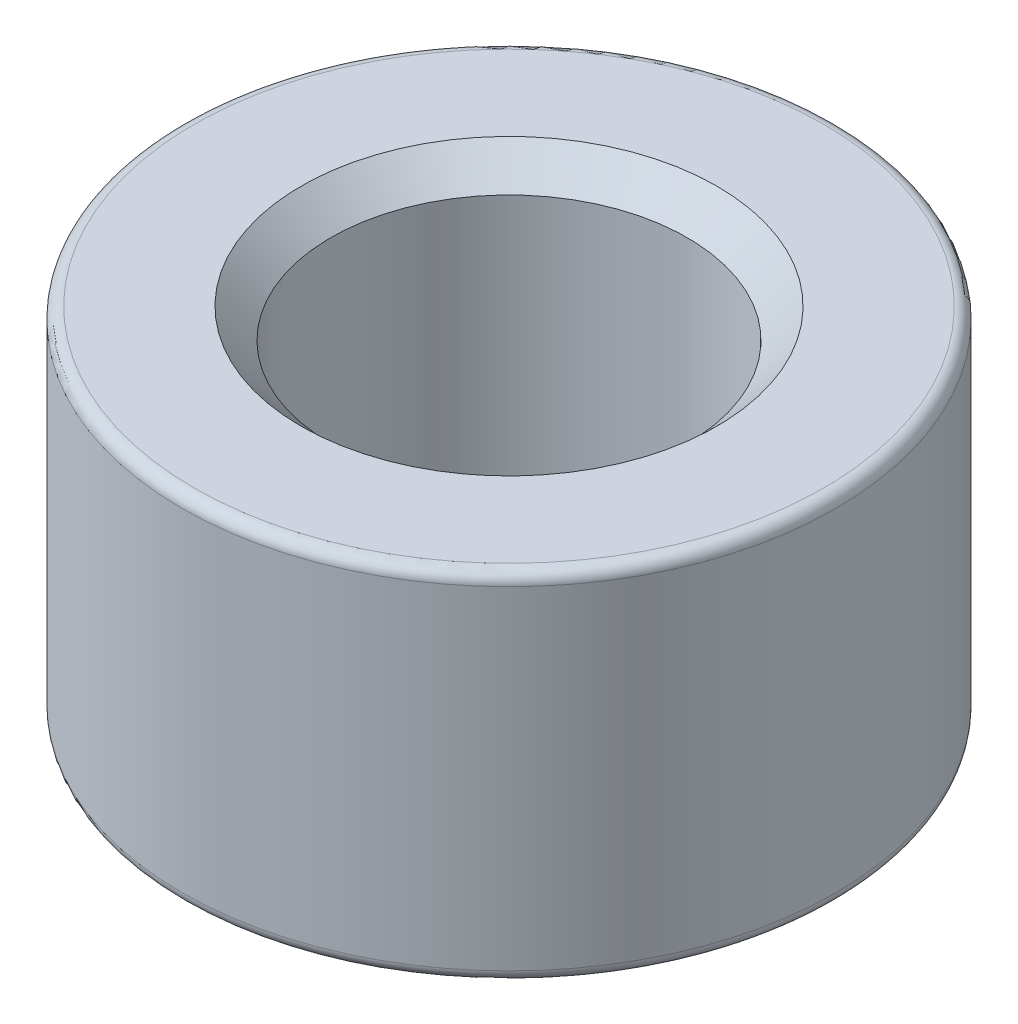
ISO-10303-21;
HEADER;
FILE_DESCRIPTION(('STEP AP214'),'2;1');
FILE_NAME('part.step','',(''),(''),'','','');
FILE_SCHEMA(('AUTOMOTIVE_DESIGN { 1 0 10303 214 1 1 1 1 }'));
ENDSEC;
DATA;
#1=APPLICATION_CONTEXT('core data for automotive mechanical design processes');
#2=APPLICATION_PROTOCOL_DEFINITION('international standard','automotive_design',2000,#1);
#3=PRODUCT_CONTEXT('',#1,'mechanical');
#4=PRODUCT('Part','Part','',(#3));
#5=PRODUCT_RELATED_PRODUCT_CATEGORY('part','',(#4));
#6=PRODUCT_DEFINITION_FORMATION('','',#4);
#7=PRODUCT_DEFINITION_CONTEXT('part definition',#1,'design');
#8=PRODUCT_DEFINITION('design','',#6,#7);
#9=PRODUCT_DEFINITION_SHAPE('','',#8);
#10=(LENGTH_UNIT() NAMED_UNIT(*) SI_UNIT(.MILLI.,.METRE.));
#11=(NAMED_UNIT(*) PLANE_ANGLE_UNIT() SI_UNIT($,.RADIAN.));
#12=(NAMED_UNIT(*) SI_UNIT($,.STERADIAN.) SOLID_ANGLE_UNIT());
#13=UNCERTAINTY_MEASURE_WITH_UNIT(LENGTH_MEASURE(1.E-05),#10,'distance_accuracy_value','');
#14=(GEOMETRIC_REPRESENTATION_CONTEXT(3) GLOBAL_UNCERTAINTY_ASSIGNED_CONTEXT((#13)) GLOBAL_UNIT_ASSIGNED_CONTEXT((#10,
#11,#12)) REPRESENTATION_CONTEXT('',''));
#15=CARTESIAN_POINT('',(0.,0.,0.));
#16=DIRECTION('',(0.,0.,1.));
#17=DIRECTION('',(1.,0.,0.));
#18=AXIS2_PLACEMENT_3D('',#15,#16,#17);
#19=CARTESIAN_POINT('',(0.,1.5,0.));
#20=DIRECTION('',(0.,1.,0.));
#21=DIRECTION('',(0.,0.,1.));
#22=AXIS2_PLACEMENT_3D('',#19,#20,#21);
#23=PLANE('',#22);
#24=CARTESIAN_POINT('',(0.,1.5,0.));
#25=DIRECTION('',(0.,1.,0.));
#26=DIRECTION('',(0.,0.,1.));
#27=AXIS2_PLACEMENT_3D('',#24,#25,#26);
#28=CIRCLE('',#27,2.65);
#29=CARTESIAN_POINT('',(0.,1.5,2.65));
#30=VERTEX_POINT('',#29);
#31=EDGE_CURVE('E10',#30,#30,#28,.T.);
#32=ORIENTED_EDGE('',*,*,#31,.T.);
#33=EDGE_LOOP('',(#32));
#34=FACE_BOUND('',#33,.T.);
#35=CARTESIAN_POINT('',(0.,1.5,0.));
#36=DIRECTION('',(0.,1.,0.));
#37=DIRECTION('',(0.,0.,1.));
#38=AXIS2_PLACEMENT_3D('',#35,#36,#37);
#39=CIRCLE('',#38,1.75);
#40=CARTESIAN_POINT('',(0.,1.5,1.75));
#41=VERTEX_POINT('',#40);
#42=EDGE_CURVE('E57',#41,#41,#39,.F.);
#43=ORIENTED_EDGE('',*,*,#42,.T.);
#44=EDGE_LOOP('',(#43));
#45=FACE_BOUND('',#44,.T.);
#46=ADVANCED_FACE('F37',(#34,#45),#23,.T.);
#47=CARTESIAN_POINT('',(0.,-1.5,0.));
#48=DIRECTION('',(0.,1.,0.));
#49=DIRECTION('',(0.,0.,1.));
#50=AXIS2_PLACEMENT_3D('',#47,#48,#49);
#51=PLANE('',#50);
#52=CARTESIAN_POINT('',(0.,-1.5,0.));
#53=DIRECTION('',(0.,1.,0.));
#54=DIRECTION('',(0.,0.,1.));
#55=AXIS2_PLACEMENT_3D('',#52,#53,#54);
#56=CIRCLE('',#55,2.65);
#57=CARTESIAN_POINT('',(0.,-1.5,2.65));
#58=VERTEX_POINT('',#57);
#59=EDGE_CURVE('E44',#58,#58,#56,.F.);
#60=ORIENTED_EDGE('',*,*,#59,.T.);
#61=EDGE_LOOP('',(#60));
#62=FACE_BOUND('',#61,.T.);
#63=CARTESIAN_POINT('',(0.,-1.5,0.));
#64=DIRECTION('',(0.,1.,0.));
#65=DIRECTION('',(0.,0.,1.));
#66=AXIS2_PLACEMENT_3D('',#63,#64,#65);
#67=CIRCLE('',#66,1.75);
#68=CARTESIAN_POINT('',(0.,-1.5,1.75));
#69=VERTEX_POINT('',#68);
#70=EDGE_CURVE('E66',#69,#69,#67,.T.);
#71=ORIENTED_EDGE('',*,*,#70,.T.);
#72=EDGE_LOOP('',(#71));
#73=FACE_BOUND('',#72,.T.);
#74=ADVANCED_FACE('F70',(#62,#73),#51,.F.);
#75=CARTESIAN_POINT('',(0.,1.5,0.));
#76=DIRECTION('',(0.,-1.,0.));
#77=DIRECTION('',(0.,0.,-1.));
#78=AXIS2_PLACEMENT_3D('',#75,#76,#77);
#79=CYLINDRICAL_SURFACE('',#78,2.75);
#80=CARTESIAN_POINT('',(0.,-1.4,0.));
#81=DIRECTION('',(0.,1.,0.));
#82=DIRECTION('',(0.,0.,1.));
#83=AXIS2_PLACEMENT_3D('',#80,#81,#82);
#84=CIRCLE('',#83,2.75);
#85=CARTESIAN_POINT('',(0.,-1.4,2.75));
#86=VERTEX_POINT('',#85);
#87=EDGE_CURVE('E48',#86,#86,#84,.T.);
#88=ORIENTED_EDGE('',*,*,#87,.T.);
#89=EDGE_LOOP('',(#88));
#90=FACE_BOUND('',#89,.T.);
#91=CARTESIAN_POINT('',(0.,1.4,0.));
#92=DIRECTION('',(0.,1.,0.));
#93=DIRECTION('',(0.,0.,1.));
#94=AXIS2_PLACEMENT_3D('',#91,#92,#93);
#95=CIRCLE('',#94,2.75);
#96=CARTESIAN_POINT('',(0.,1.4,2.75));
#97=VERTEX_POINT('',#96);
#98=EDGE_CURVE('E52',#97,#97,#95,.F.);
#99=ORIENTED_EDGE('',*,*,#98,.T.);
#100=EDGE_LOOP('',(#99));
#101=FACE_BOUND('',#100,.T.);
#102=ADVANCED_FACE('F85',(#90,#101),#79,.T.);
#103=CARTESIAN_POINT('',(0.,1.5,0.));
#104=DIRECTION('',(0.,-1.,0.));
#105=DIRECTION('',(0.,0.,-1.));
#106=AXIS2_PLACEMENT_3D('',#103,#104,#105);
#107=CYLINDRICAL_SURFACE('',#106,1.5);
#108=CARTESIAN_POINT('',(0.,-1.25,0.));
#109=DIRECTION('',(0.,1.,0.));
#110=DIRECTION('',(0.,0.,1.));
#111=AXIS2_PLACEMENT_3D('',#108,#109,#110);
#112=CIRCLE('',#111,1.5);
#113=CARTESIAN_POINT('',(0.,-1.25,1.5));
#114=VERTEX_POINT('',#113);
#115=EDGE_CURVE('E60',#114,#114,#112,.F.);
#116=ORIENTED_EDGE('',*,*,#115,.T.);
#117=EDGE_LOOP('',(#116));
#118=FACE_BOUND('',#117,.T.);
#119=CARTESIAN_POINT('',(0.,1.25,0.));
#120=DIRECTION('',(0.,1.,0.));
#121=DIRECTION('',(0.,0.,1.));
#122=AXIS2_PLACEMENT_3D('',#119,#120,#121);
#123=CIRCLE('',#122,1.5);
#124=CARTESIAN_POINT('',(0.,1.25,1.5));
#125=VERTEX_POINT('',#124);
#126=EDGE_CURVE('E63',#125,#125,#123,.T.);
#127=ORIENTED_EDGE('',*,*,#126,.T.);
#128=EDGE_LOOP('',(#127));
#129=FACE_BOUND('',#128,.T.);
#130=ADVANCED_FACE('F75',(#118,#129),#107,.F.);
#131=CARTESIAN_POINT('',(0.,-1.5,0.));
#132=DIRECTION('',(0.,-1.,0.));
#133=DIRECTION('',(0.,0.,-1.));
#134=AXIS2_PLACEMENT_3D('',#131,#132,#133);
#135=CONICAL_SURFACE('',#134,1.75,0.785398163397447);
#136=ORIENTED_EDGE('',*,*,#115,.F.);
#137=EDGE_LOOP('',(#136));
#138=FACE_BOUND('',#137,.T.);
#139=ORIENTED_EDGE('',*,*,#70,.F.);
#140=EDGE_LOOP('',(#139));
#141=FACE_BOUND('',#140,.T.);
#142=ADVANCED_FACE('F72',(#138,#141),#135,.F.);
#143=CARTESIAN_POINT('',(0.,1.25,0.));
#144=DIRECTION('',(0.,1.,0.));
#145=DIRECTION('',(0.,0.,1.));
#146=AXIS2_PLACEMENT_3D('',#143,#144,#145);
#147=CONICAL_SURFACE('',#146,1.5,0.78539816339745);
#148=ORIENTED_EDGE('',*,*,#42,.F.);
#149=EDGE_LOOP('',(#148));
#150=FACE_BOUND('',#149,.T.);
#151=ORIENTED_EDGE('',*,*,#126,.F.);
#152=EDGE_LOOP('',(#151));
#153=FACE_BOUND('',#152,.T.);
#154=ADVANCED_FACE('F74',(#150,#153),#147,.F.);
#155=CARTESIAN_POINT('',(0.,-1.4,0.));
#156=DIRECTION('',(0.,1.,0.));
#157=DIRECTION('',(0.,0.,1.));
#158=AXIS2_PLACEMENT_3D('',#155,#156,#157);
#159=TOROIDAL_SURFACE('',#158,2.65,0.1);
#160=ORIENTED_EDGE('',*,*,#59,.F.);
#161=EDGE_LOOP('',(#160));
#162=FACE_BOUND('',#161,.T.);
#163=ORIENTED_EDGE('',*,*,#87,.F.);
#164=EDGE_LOOP('',(#163));
#165=FACE_BOUND('',#164,.T.);
#166=ADVANCED_FACE('F82',(#162,#165),#159,.T.);
#167=CARTESIAN_POINT('',(0.,1.4,0.));
#168=DIRECTION('',(0.,1.,0.));
#169=DIRECTION('',(0.,0.,1.));
#170=AXIS2_PLACEMENT_3D('',#167,#168,#169);
#171=TOROIDAL_SURFACE('',#170,2.65,0.1);
#172=ORIENTED_EDGE('',*,*,#98,.F.);
#173=EDGE_LOOP('',(#172));
#174=FACE_BOUND('',#173,.T.);
#175=ORIENTED_EDGE('',*,*,#31,.F.);
#176=EDGE_LOOP('',(#175));
#177=FACE_BOUND('',#176,.T.);
#178=ADVANCED_FACE('F39',(#174,#177),#171,.T.);
#179=CLOSED_SHELL('',(#46,#74,#102,#130,#142,#154,#166,#178));
#180=MANIFOLD_SOLID_BREP('B2',#179);
#181=ADVANCED_BREP_SHAPE_REPRESENTATION('',(#18,#180),#14);
#182=SHAPE_DEFINITION_REPRESENTATION(#9,#181);
ENDSEC;
END-ISO-10303-21;
